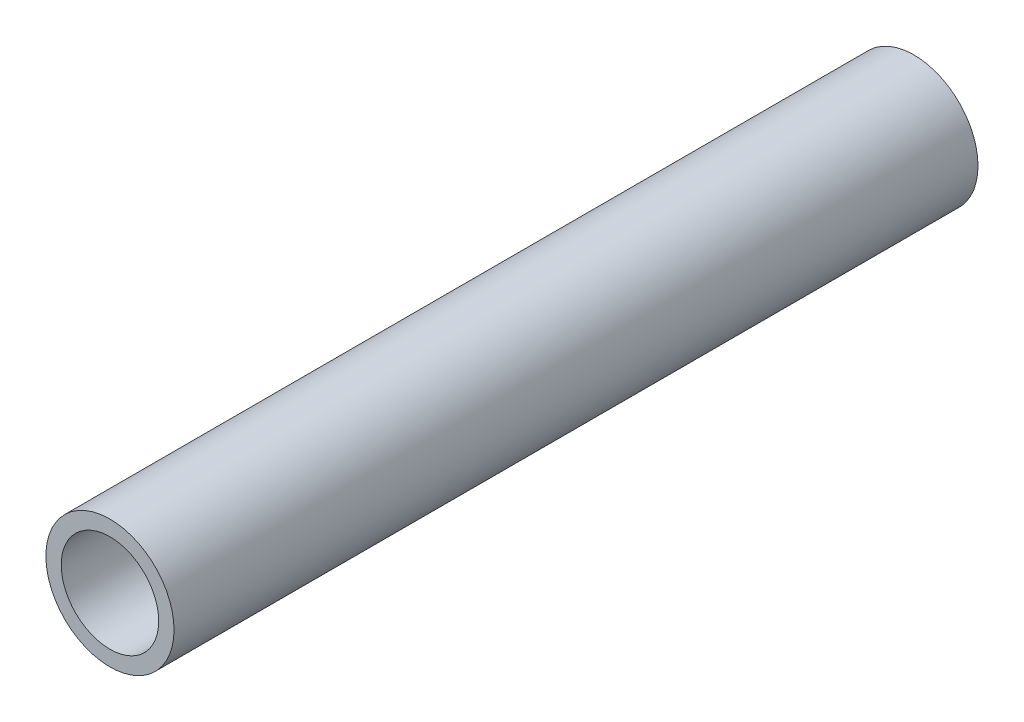
ISO-10303-21;
HEADER;
FILE_DESCRIPTION(('STEP AP214'),'2;1');
FILE_NAME('part.step','',(''),(''),'','','');
FILE_SCHEMA(('AUTOMOTIVE_DESIGN { 1 0 10303 214 1 1 1 1 }'));
ENDSEC;
DATA;
#1=APPLICATION_CONTEXT('core data for automotive mechanical design processes');
#2=APPLICATION_PROTOCOL_DEFINITION('international standard','automotive_design',2000,#1);
#3=PRODUCT_CONTEXT('',#1,'mechanical');
#4=PRODUCT('Part','Part','',(#3));
#5=PRODUCT_RELATED_PRODUCT_CATEGORY('part','',(#4));
#6=PRODUCT_DEFINITION_FORMATION('','',#4);
#7=PRODUCT_DEFINITION_CONTEXT('part definition',#1,'design');
#8=PRODUCT_DEFINITION('design','',#6,#7);
#9=PRODUCT_DEFINITION_SHAPE('','',#8);
#10=(LENGTH_UNIT() NAMED_UNIT(*) SI_UNIT(.MILLI.,.METRE.));
#11=(NAMED_UNIT(*) PLANE_ANGLE_UNIT() SI_UNIT($,.RADIAN.));
#12=(NAMED_UNIT(*) SI_UNIT($,.STERADIAN.) SOLID_ANGLE_UNIT());
#13=UNCERTAINTY_MEASURE_WITH_UNIT(LENGTH_MEASURE(1.E-05),#10,'distance_accuracy_value','');
#14=(GEOMETRIC_REPRESENTATION_CONTEXT(3) GLOBAL_UNCERTAINTY_ASSIGNED_CONTEXT((#13)) GLOBAL_UNIT_ASSIGNED_CONTEXT((#10,
#11,#12)) REPRESENTATION_CONTEXT('',''));
#15=CARTESIAN_POINT('',(0.,0.,0.));
#16=DIRECTION('',(0.,0.,1.));
#17=DIRECTION('',(1.,0.,0.));
#18=AXIS2_PLACEMENT_3D('',#15,#16,#17);
#19=CARTESIAN_POINT('',(0.,0.,209.55));
#20=DIRECTION('',(0.,0.,1.));
#21=DIRECTION('',(1.,0.,0.));
#22=AXIS2_PLACEMENT_3D('',#19,#20,#21);
#23=PLANE('',#22);
#24=CARTESIAN_POINT('',(0.,0.,209.55));
#25=DIRECTION('',(0.,0.,1.));
#26=DIRECTION('',(1.,0.,0.));
#27=AXIS2_PLACEMENT_3D('',#24,#25,#26);
#28=CIRCLE('',#27,16.7005);
#29=CARTESIAN_POINT('',(16.7005,0.,209.55));
#30=VERTEX_POINT('',#29);
#31=EDGE_CURVE('E10',#30,#30,#28,.T.);
#32=ORIENTED_EDGE('',*,*,#31,.T.);
#33=EDGE_LOOP('',(#32));
#34=FACE_BOUND('',#33,.T.);
#35=CARTESIAN_POINT('',(0.,0.,209.55));
#36=DIRECTION('',(0.,0.,1.));
#37=DIRECTION('',(1.,0.,0.));
#38=AXIS2_PLACEMENT_3D('',#35,#36,#37);
#39=CIRCLE('',#38,12.7);
#40=CARTESIAN_POINT('',(12.7,0.,209.55));
#41=VERTEX_POINT('',#40);
#42=EDGE_CURVE('E44',#41,#41,#39,.T.);
#43=ORIENTED_EDGE('',*,*,#42,.F.);
#44=EDGE_LOOP('',(#43));
#45=FACE_BOUND('',#44,.T.);
#46=ADVANCED_FACE('F33',(#34,#45),#23,.T.);
#47=CARTESIAN_POINT('',(0.,0.,0.));
#48=DIRECTION('',(0.,0.,1.));
#49=DIRECTION('',(1.,0.,0.));
#50=AXIS2_PLACEMENT_3D('',#47,#48,#49);
#51=PLANE('',#50);
#52=CARTESIAN_POINT('',(0.,0.,0.));
#53=DIRECTION('',(0.,0.,1.));
#54=DIRECTION('',(1.,0.,0.));
#55=AXIS2_PLACEMENT_3D('',#52,#53,#54);
#56=CIRCLE('',#55,16.7005);
#57=CARTESIAN_POINT('',(16.7005,0.,0.));
#58=VERTEX_POINT('',#57);
#59=EDGE_CURVE('E37',#58,#58,#56,.T.);
#60=ORIENTED_EDGE('',*,*,#59,.F.);
#61=EDGE_LOOP('',(#60));
#62=FACE_BOUND('',#61,.T.);
#63=CARTESIAN_POINT('',(0.,0.,0.));
#64=DIRECTION('',(0.,0.,1.));
#65=DIRECTION('',(1.,0.,0.));
#66=AXIS2_PLACEMENT_3D('',#63,#64,#65);
#67=CIRCLE('',#66,12.7);
#68=CARTESIAN_POINT('',(12.7,0.,0.));
#69=VERTEX_POINT('',#68);
#70=EDGE_CURVE('E46',#69,#69,#67,.T.);
#71=ORIENTED_EDGE('',*,*,#70,.T.);
#72=EDGE_LOOP('',(#71));
#73=FACE_BOUND('',#72,.T.);
#74=ADVANCED_FACE('F56',(#62,#73),#51,.F.);
#75=CARTESIAN_POINT('',(0.,0.,209.55));
#76=DIRECTION('',(0.,0.,-1.));
#77=DIRECTION('',(-1.,0.,0.));
#78=AXIS2_PLACEMENT_3D('',#75,#76,#77);
#79=CYLINDRICAL_SURFACE('',#78,16.7005);
#80=ORIENTED_EDGE('',*,*,#31,.F.);
#81=EDGE_LOOP('',(#80));
#82=FACE_BOUND('',#81,.T.);
#83=ORIENTED_EDGE('',*,*,#59,.T.);
#84=EDGE_LOOP('',(#83));
#85=FACE_BOUND('',#84,.T.);
#86=ADVANCED_FACE('F35',(#82,#85),#79,.T.);
#87=CARTESIAN_POINT('',(0.,0.,209.55));
#88=DIRECTION('',(0.,0.,-1.));
#89=DIRECTION('',(-1.,0.,0.));
#90=AXIS2_PLACEMENT_3D('',#87,#88,#89);
#91=CYLINDRICAL_SURFACE('',#90,12.7);
#92=ORIENTED_EDGE('',*,*,#42,.T.);
#93=EDGE_LOOP('',(#92));
#94=FACE_BOUND('',#93,.T.);
#95=ORIENTED_EDGE('',*,*,#70,.F.);
#96=EDGE_LOOP('',(#95));
#97=FACE_BOUND('',#96,.T.);
#98=ADVANCED_FACE('F52',(#94,#97),#91,.F.);
#99=CLOSED_SHELL('',(#46,#74,#86,#98));
#100=MANIFOLD_SOLID_BREP('B2',#99);
#101=ADVANCED_BREP_SHAPE_REPRESENTATION('',(#18,#100),#14);
#102=SHAPE_DEFINITION_REPRESENTATION(#9,#101);
ENDSEC;
END-ISO-10303-21;
